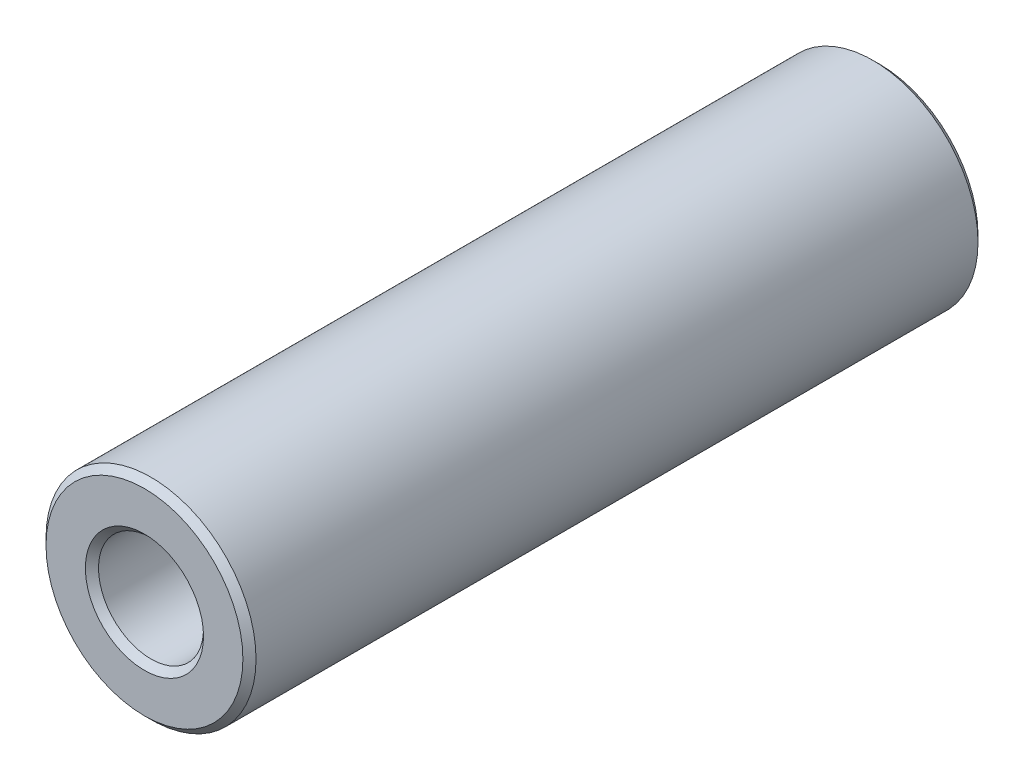
ISO-10303-21;
HEADER;
FILE_DESCRIPTION(('STEP AP214'),'2;1');
FILE_NAME('part.step','',(''),(''),'','','');
FILE_SCHEMA(('AUTOMOTIVE_DESIGN { 1 0 10303 214 1 1 1 1 }'));
ENDSEC;
DATA;
#1=APPLICATION_CONTEXT('core data for automotive mechanical design processes');
#2=APPLICATION_PROTOCOL_DEFINITION('international standard','automotive_design',2000,#1);
#3=PRODUCT_CONTEXT('',#1,'mechanical');
#4=PRODUCT('Part','Part','',(#3));
#5=PRODUCT_RELATED_PRODUCT_CATEGORY('part','',(#4));
#6=PRODUCT_DEFINITION_FORMATION('','',#4);
#7=PRODUCT_DEFINITION_CONTEXT('part definition',#1,'design');
#8=PRODUCT_DEFINITION('design','',#6,#7);
#9=PRODUCT_DEFINITION_SHAPE('','',#8);
#10=(LENGTH_UNIT() NAMED_UNIT(*) SI_UNIT(.MILLI.,.METRE.));
#11=(NAMED_UNIT(*) PLANE_ANGLE_UNIT() SI_UNIT($,.RADIAN.));
#12=(NAMED_UNIT(*) SI_UNIT($,.STERADIAN.) SOLID_ANGLE_UNIT());
#13=UNCERTAINTY_MEASURE_WITH_UNIT(LENGTH_MEASURE(1.E-05),#10,'distance_accuracy_value','');
#14=(GEOMETRIC_REPRESENTATION_CONTEXT(3) GLOBAL_UNCERTAINTY_ASSIGNED_CONTEXT((#13)) GLOBAL_UNIT_ASSIGNED_CONTEXT((#10,
#11,#12)) REPRESENTATION_CONTEXT('',''));
#15=CARTESIAN_POINT('',(0.,0.,0.));
#16=DIRECTION('',(0.,0.,1.));
#17=DIRECTION('',(1.,0.,0.));
#18=AXIS2_PLACEMENT_3D('',#15,#16,#17);
#19=CARTESIAN_POINT('',(0.,0.,28.));
#20=DIRECTION('',(0.,0.,0.999999999999999));
#21=DIRECTION('',(1.,0.,0.));
#22=AXIS2_PLACEMENT_3D('',#19,#20,#21);
#23=PLANE('',#22);
#24=CARTESIAN_POINT('',(0.,0.,28.));
#25=DIRECTION('',(0.,0.,0.999999999999999));
#26=DIRECTION('',(1.,0.,0.));
#27=AXIS2_PLACEMENT_3D('',#24,#25,#26);
#28=CIRCLE('',#27,2.25);
#29=CARTESIAN_POINT('',(2.25,0.,28.));
#30=VERTEX_POINT('',#29);
#31=EDGE_CURVE('E50',#30,#30,#28,.F.);
#32=ORIENTED_EDGE('',*,*,#31,.T.);
#33=EDGE_LOOP('',(#32));
#34=FACE_BOUND('',#33,.T.);
#35=CARTESIAN_POINT('',(0.,0.,28.));
#36=DIRECTION('',(0.,0.,0.999999999999999));
#37=DIRECTION('',(1.,0.,0.));
#38=AXIS2_PLACEMENT_3D('',#35,#36,#37);
#39=CIRCLE('',#38,3.75);
#40=CARTESIAN_POINT('',(-3.75,0.,28.));
#41=VERTEX_POINT('',#40);
#42=EDGE_CURVE('E53',#41,#41,#39,.T.);
#43=ORIENTED_EDGE('',*,*,#42,.T.);
#44=EDGE_LOOP('',(#43));
#45=FACE_BOUND('',#44,.T.);
#46=ADVANCED_FACE('F30',(#34,#45),#23,.T.);
#47=CARTESIAN_POINT('',(0.,0.,0.));
#48=DIRECTION('',(0.,0.,0.999999999999999));
#49=DIRECTION('',(1.,0.,0.));
#50=AXIS2_PLACEMENT_3D('',#47,#48,#49);
#51=PLANE('',#50);
#52=CARTESIAN_POINT('',(0.,0.,0.));
#53=DIRECTION('',(0.,0.,0.999999999999999));
#54=DIRECTION('',(1.,0.,0.));
#55=AXIS2_PLACEMENT_3D('',#52,#53,#54);
#56=CIRCLE('',#55,3.75);
#57=CARTESIAN_POINT('',(3.75,0.,0.));
#58=VERTEX_POINT('',#57);
#59=EDGE_CURVE('E10',#58,#58,#56,.F.);
#60=ORIENTED_EDGE('',*,*,#59,.T.);
#61=EDGE_LOOP('',(#60));
#62=FACE_BOUND('',#61,.T.);
#63=CARTESIAN_POINT('',(0.,0.,0.));
#64=DIRECTION('',(0.,0.,0.999999999999999));
#65=DIRECTION('',(1.,0.,0.));
#66=AXIS2_PLACEMENT_3D('',#63,#64,#65);
#67=CIRCLE('',#66,2.25);
#68=CARTESIAN_POINT('',(-2.25,0.,0.));
#69=VERTEX_POINT('',#68);
#70=EDGE_CURVE('E37',#69,#69,#67,.T.);
#71=ORIENTED_EDGE('',*,*,#70,.T.);
#72=EDGE_LOOP('',(#71));
#73=FACE_BOUND('',#72,.T.);
#74=ADVANCED_FACE('F77',(#62,#73),#51,.F.);
#75=CARTESIAN_POINT('',(0.,0.,28.));
#76=DIRECTION('',(0.,0.,-0.999999999999999));
#77=DIRECTION('',(-1.,0.,0.));
#78=AXIS2_PLACEMENT_3D('',#75,#76,#77);
#79=CYLINDRICAL_SURFACE('',#78,4.);
#80=CARTESIAN_POINT('',(0.,0.,27.75));
#81=DIRECTION('',(0.,0.,0.999999999999999));
#82=DIRECTION('',(1.,0.,0.));
#83=AXIS2_PLACEMENT_3D('',#80,#81,#82);
#84=CIRCLE('',#83,4.);
#85=CARTESIAN_POINT('',(-4.,0.,27.75));
#86=VERTEX_POINT('',#85);
#87=EDGE_CURVE('E41',#86,#86,#84,.F.);
#88=CARTESIAN_POINT('',(0.,0.,0.25));
#89=DIRECTION('',(0.,0.,0.999999999999999));
#90=DIRECTION('',(1.,0.,0.));
#91=AXIS2_PLACEMENT_3D('',#88,#89,#90);
#92=CIRCLE('',#91,4.);
#93=CARTESIAN_POINT('',(-4.,0.,0.249999999999997));
#94=VERTEX_POINT('',#93);
#95=EDGE_CURVE('E45',#94,#94,#92,.T.);
#96=CARTESIAN_POINT('',(-4.,0.,27.75));
#97=CARTESIAN_POINT('',(-4.,0.,27.4635416666666));
#98=CARTESIAN_POINT('',(-4.,0.,27.1770833333333));
#99=CARTESIAN_POINT('',(-4.,0.,26.6041666666666));
#100=CARTESIAN_POINT('',(-4.,0.,26.3177083333333));
#101=CARTESIAN_POINT('',(-4.,0.,25.7447916666666));
#102=CARTESIAN_POINT('',(-4.,0.,25.4583333333333));
#103=CARTESIAN_POINT('',(-4.,0.,24.8854166666666));
#104=CARTESIAN_POINT('',(-4.,0.,24.5989583333333));
#105=CARTESIAN_POINT('',(-4.,0.,24.0260416666666));
#106=CARTESIAN_POINT('',(-4.,0.,23.7395833333333));
#107=CARTESIAN_POINT('',(-4.,0.,23.1666666666666));
#108=CARTESIAN_POINT('',(-4.,0.,22.8802083333333));
#109=CARTESIAN_POINT('',(-4.,0.,22.3072916666666));
#110=CARTESIAN_POINT('',(-4.,0.,22.0208333333333));
#111=CARTESIAN_POINT('',(-4.,0.,21.4479166666666));
#112=CARTESIAN_POINT('',(-4.,0.,21.1614583333333));
#113=CARTESIAN_POINT('',(-4.,0.,20.5885416666666));
#114=CARTESIAN_POINT('',(-4.,0.,20.3020833333333));
#115=CARTESIAN_POINT('',(-4.,0.,19.7291666666666));
#116=CARTESIAN_POINT('',(-4.,0.,19.4427083333333));
#117=CARTESIAN_POINT('',(-4.,0.,18.8697916666666));
#118=CARTESIAN_POINT('',(-4.,0.,18.5833333333333));
#119=CARTESIAN_POINT('',(-4.,0.,18.0104166666666));
#120=CARTESIAN_POINT('',(-4.,0.,17.7239583333333));
#121=CARTESIAN_POINT('',(-4.,0.,17.1510416666666));
#122=CARTESIAN_POINT('',(-4.,0.,16.8645833333333));
#123=CARTESIAN_POINT('',(-4.,0.,16.2916666666666));
#124=CARTESIAN_POINT('',(-4.,0.,16.0052083333333));
#125=CARTESIAN_POINT('',(-4.,0.,15.4322916666666));
#126=CARTESIAN_POINT('',(-4.,0.,15.1458333333333));
#127=CARTESIAN_POINT('',(-4.,0.,14.5729166666666));
#128=CARTESIAN_POINT('',(-4.,0.,14.2864583333333));
#129=CARTESIAN_POINT('',(-4.,0.,13.7135416666666));
#130=CARTESIAN_POINT('',(-4.,0.,13.4270833333333));
#131=CARTESIAN_POINT('',(-4.,0.,12.8541666666666));
#132=CARTESIAN_POINT('',(-4.,0.,12.5677083333333));
#133=CARTESIAN_POINT('',(-4.,0.,11.9947916666666));
#134=CARTESIAN_POINT('',(-4.,0.,11.7083333333333));
#135=CARTESIAN_POINT('',(-4.,0.,11.1354166666666));
#136=CARTESIAN_POINT('',(-4.,0.,10.8489583333333));
#137=CARTESIAN_POINT('',(-4.,0.,10.2760416666667));
#138=CARTESIAN_POINT('',(-4.,0.,9.98958333333332));
#139=CARTESIAN_POINT('',(-4.,0.,9.41666666666665));
#140=CARTESIAN_POINT('',(-4.,0.,9.13020833333332));
#141=CARTESIAN_POINT('',(-4.,0.,8.55729166666665));
#142=CARTESIAN_POINT('',(-4.,0.,8.27083333333332));
#143=CARTESIAN_POINT('',(-4.,0.,7.69791666666666));
#144=CARTESIAN_POINT('',(-4.,0.,7.41145833333332));
#145=CARTESIAN_POINT('',(-4.,0.,6.83854166666666));
#146=CARTESIAN_POINT('',(-4.,0.,6.55208333333332));
#147=CARTESIAN_POINT('',(-4.,0.,5.97916666666666));
#148=CARTESIAN_POINT('',(-4.,0.,5.69270833333332));
#149=CARTESIAN_POINT('',(-4.,0.,5.11979166666666));
#150=CARTESIAN_POINT('',(-4.,0.,4.83333333333333));
#151=CARTESIAN_POINT('',(-4.,0.,4.26041666666666));
#152=CARTESIAN_POINT('',(-4.,0.,3.97395833333333));
#153=CARTESIAN_POINT('',(-4.,0.,3.40104166666666));
#154=CARTESIAN_POINT('',(-4.,0.,3.11458333333333));
#155=CARTESIAN_POINT('',(-4.,0.,2.54166666666666));
#156=CARTESIAN_POINT('',(-4.,0.,2.25520833333333));
#157=CARTESIAN_POINT('',(-4.,0.,1.68229166666666));
#158=CARTESIAN_POINT('',(-4.,0.,1.39583333333333));
#159=CARTESIAN_POINT('',(-4.,0.,0.822916666666663));
#160=CARTESIAN_POINT('',(-4.,0.,0.53645833333333));
#161=CARTESIAN_POINT('',(-4.,0.,0.249999999999997));
#162=B_SPLINE_CURVE_WITH_KNOTS('',3,(#96,#97,#98,#99,#100,#101,#102,#103,#104,#105,#106,#107,
#108,#109,#110,#111,#112,#113,#114,#115,#116,#117,#118,#119,#120,#121,#122,#123,#124,#125,#126,
#127,#128,#129,#130,#131,#132,#133,#134,#135,#136,#137,#138,#139,#140,#141,#142,#143,#144,#145,
#146,#147,#148,#149,#150,#151,#152,#153,#154,#155,#156,#157,#158,#159,#160,#161),.UNSPECIFIED.,
.F.,.F.,(4,2,2,2,2,2,2,2,2,2,2,2,2,2,2,2,2,2,2,2,2,2,2,2,2,2,2,2,2,2,2,2,4),(0.,
0.859374999999996,1.71874999999999,2.57812499999999,3.43749999999999,4.29687499999999,
5.15624999999999,6.01562499999999,6.87499999999999,7.73437499999999,8.59374999999999,
9.45312499999998,10.3125,11.171875,12.03125,12.890625,13.75,14.609375,15.46875,16.328125,
17.1875,18.046875,18.90625,19.765625,20.625,21.484375,22.34375,23.203125,24.0625,24.921875,
25.78125,26.640625,27.5),.UNSPECIFIED.);
#163=EDGE_CURVE('BSEAM32',#86,#94,#162,.T.);
#164=ORIENTED_EDGE('',*,*,#87,.T.);
#165=ORIENTED_EDGE('',*,*,#95,.T.);
#166=ORIENTED_EDGE('',*,*,#163,.T.);
#167=ORIENTED_EDGE('',*,*,#163,.F.);
#168=EDGE_LOOP('',(#164,#166,#165,#167));
#169=FACE_BOUND('',#168,.T.);
#170=ADVANCED_FACE('F32',(#169),#79,.T.);
#171=CARTESIAN_POINT('',(0.,0.,28.));
#172=DIRECTION('',(0.,0.,-0.999999999999999));
#173=DIRECTION('',(-1.,0.,0.));
#174=AXIS2_PLACEMENT_3D('',#171,#172,#173);
#175=CYLINDRICAL_SURFACE('',#174,2.);
#176=CARTESIAN_POINT('',(0.,0.,27.75));
#177=DIRECTION('',(0.,0.,0.999999999999999));
#178=DIRECTION('',(1.,0.,0.));
#179=AXIS2_PLACEMENT_3D('',#176,#177,#178);
#180=CIRCLE('',#179,2.);
#181=CARTESIAN_POINT('',(-2.,0.,27.75));
#182=VERTEX_POINT('',#181);
#183=EDGE_CURVE('E56',#182,#182,#180,.T.);
#184=CARTESIAN_POINT('',(0.,0.,0.25));
#185=DIRECTION('',(0.,0.,0.999999999999999));
#186=DIRECTION('',(1.,0.,0.));
#187=AXIS2_PLACEMENT_3D('',#184,#185,#186);
#188=CIRCLE('',#187,2.);
#189=CARTESIAN_POINT('',(-2.,0.,0.249999999999997));
#190=VERTEX_POINT('',#189);
#191=EDGE_CURVE('E59',#190,#190,#188,.F.);
#192=CARTESIAN_POINT('',(-2.,0.,27.75));
#193=CARTESIAN_POINT('',(-2.,0.,27.4635416666666));
#194=CARTESIAN_POINT('',(-2.,0.,27.1770833333333));
#195=CARTESIAN_POINT('',(-2.,0.,26.6041666666666));
#196=CARTESIAN_POINT('',(-2.,0.,26.3177083333333));
#197=CARTESIAN_POINT('',(-2.,0.,25.7447916666666));
#198=CARTESIAN_POINT('',(-2.,0.,25.4583333333333));
#199=CARTESIAN_POINT('',(-2.,0.,24.8854166666666));
#200=CARTESIAN_POINT('',(-2.,0.,24.5989583333333));
#201=CARTESIAN_POINT('',(-2.,0.,24.0260416666666));
#202=CARTESIAN_POINT('',(-2.,0.,23.7395833333333));
#203=CARTESIAN_POINT('',(-2.,0.,23.1666666666666));
#204=CARTESIAN_POINT('',(-2.,0.,22.8802083333333));
#205=CARTESIAN_POINT('',(-2.,0.,22.3072916666666));
#206=CARTESIAN_POINT('',(-2.,0.,22.0208333333333));
#207=CARTESIAN_POINT('',(-2.,0.,21.4479166666666));
#208=CARTESIAN_POINT('',(-2.,0.,21.1614583333333));
#209=CARTESIAN_POINT('',(-2.,0.,20.5885416666666));
#210=CARTESIAN_POINT('',(-2.,0.,20.3020833333333));
#211=CARTESIAN_POINT('',(-2.,0.,19.7291666666666));
#212=CARTESIAN_POINT('',(-2.,0.,19.4427083333333));
#213=CARTESIAN_POINT('',(-2.,0.,18.8697916666666));
#214=CARTESIAN_POINT('',(-2.,0.,18.5833333333333));
#215=CARTESIAN_POINT('',(-2.,0.,18.0104166666666));
#216=CARTESIAN_POINT('',(-2.,0.,17.7239583333333));
#217=CARTESIAN_POINT('',(-2.,0.,17.1510416666666));
#218=CARTESIAN_POINT('',(-2.,0.,16.8645833333333));
#219=CARTESIAN_POINT('',(-2.,0.,16.2916666666666));
#220=CARTESIAN_POINT('',(-2.,0.,16.0052083333333));
#221=CARTESIAN_POINT('',(-2.,0.,15.4322916666666));
#222=CARTESIAN_POINT('',(-2.,0.,15.1458333333333));
#223=CARTESIAN_POINT('',(-2.,0.,14.5729166666666));
#224=CARTESIAN_POINT('',(-2.,0.,14.2864583333333));
#225=CARTESIAN_POINT('',(-2.,0.,13.7135416666666));
#226=CARTESIAN_POINT('',(-2.,0.,13.4270833333333));
#227=CARTESIAN_POINT('',(-2.,0.,12.8541666666666));
#228=CARTESIAN_POINT('',(-2.,0.,12.5677083333333));
#229=CARTESIAN_POINT('',(-2.,0.,11.9947916666666));
#230=CARTESIAN_POINT('',(-2.,0.,11.7083333333333));
#231=CARTESIAN_POINT('',(-2.,0.,11.1354166666666));
#232=CARTESIAN_POINT('',(-2.,0.,10.8489583333333));
#233=CARTESIAN_POINT('',(-2.,0.,10.2760416666667));
#234=CARTESIAN_POINT('',(-2.,0.,9.98958333333332));
#235=CARTESIAN_POINT('',(-2.,0.,9.41666666666665));
#236=CARTESIAN_POINT('',(-2.,0.,9.13020833333332));
#237=CARTESIAN_POINT('',(-2.,0.,8.55729166666665));
#238=CARTESIAN_POINT('',(-2.,0.,8.27083333333332));
#239=CARTESIAN_POINT('',(-2.,0.,7.69791666666666));
#240=CARTESIAN_POINT('',(-2.,0.,7.41145833333332));
#241=CARTESIAN_POINT('',(-2.,0.,6.83854166666666));
#242=CARTESIAN_POINT('',(-2.,0.,6.55208333333332));
#243=CARTESIAN_POINT('',(-2.,0.,5.97916666666666));
#244=CARTESIAN_POINT('',(-2.,0.,5.69270833333332));
#245=CARTESIAN_POINT('',(-2.,0.,5.11979166666666));
#246=CARTESIAN_POINT('',(-2.,0.,4.83333333333333));
#247=CARTESIAN_POINT('',(-2.,0.,4.26041666666666));
#248=CARTESIAN_POINT('',(-2.,0.,3.97395833333333));
#249=CARTESIAN_POINT('',(-2.,0.,3.40104166666666));
#250=CARTESIAN_POINT('',(-2.,0.,3.11458333333333));
#251=CARTESIAN_POINT('',(-2.,0.,2.54166666666666));
#252=CARTESIAN_POINT('',(-2.,0.,2.25520833333333));
#253=CARTESIAN_POINT('',(-2.,0.,1.68229166666666));
#254=CARTESIAN_POINT('',(-2.,0.,1.39583333333333));
#255=CARTESIAN_POINT('',(-2.,0.,0.822916666666663));
#256=CARTESIAN_POINT('',(-2.,0.,0.53645833333333));
#257=CARTESIAN_POINT('',(-2.,0.,0.249999999999997));
#258=B_SPLINE_CURVE_WITH_KNOTS('',3,(#192,#193,#194,#195,#196,#197,#198,#199,#200,#201,#202,
#203,#204,#205,#206,#207,#208,#209,#210,#211,#212,#213,#214,#215,#216,#217,#218,#219,#220,#221,
#222,#223,#224,#225,#226,#227,#228,#229,#230,#231,#232,#233,#234,#235,#236,#237,#238,#239,#240,
#241,#242,#243,#244,#245,#246,#247,#248,#249,#250,#251,#252,#253,#254,#255,#256,#257),
.UNSPECIFIED.,.F.,.F.,(4,2,2,2,2,2,2,2,2,2,2,2,2,2,2,2,2,2,2,2,2,2,2,2,2,2,2,2,2,2,2,2,4),(0.,
0.859374999999996,1.71874999999999,2.57812499999999,3.43749999999999,4.29687499999999,
5.15624999999999,6.01562499999999,6.87499999999999,7.73437499999999,8.59374999999999,
9.45312499999998,10.3125,11.171875,12.03125,12.890625,13.75,14.609375,15.46875,16.328125,
17.1875,18.046875,18.90625,19.765625,20.625,21.484375,22.34375,23.203125,24.0625,24.921875,
25.78125,26.640625,27.5),.UNSPECIFIED.);
#259=EDGE_CURVE('BSEAM63',#182,#190,#258,.T.);
#260=ORIENTED_EDGE('',*,*,#183,.T.);
#261=ORIENTED_EDGE('',*,*,#191,.T.);
#262=ORIENTED_EDGE('',*,*,#259,.T.);
#263=ORIENTED_EDGE('',*,*,#259,.F.);
#264=EDGE_LOOP('',(#260,#262,#261,#263));
#265=FACE_BOUND('',#264,.T.);
#266=ADVANCED_FACE('F63',(#265),#175,.F.);
#267=CARTESIAN_POINT('',(0.,0.,27.75));
#268=DIRECTION('',(0.,0.,0.999999999999999));
#269=DIRECTION('',(1.,0.,0.));
#270=AXIS2_PLACEMENT_3D('',#267,#268,#269);
#271=CONICAL_SURFACE('',#270,2.,0.785398163397445);
#272=ORIENTED_EDGE('',*,*,#31,.F.);
#273=EDGE_LOOP('',(#272));
#274=FACE_BOUND('',#273,.T.);
#275=ORIENTED_EDGE('',*,*,#183,.F.);
#276=EDGE_LOOP('',(#275));
#277=FACE_BOUND('',#276,.T.);
#278=ADVANCED_FACE('F87',(#274,#277),#271,.F.);
#279=CARTESIAN_POINT('',(0.,0.,28.));
#280=DIRECTION('',(0.,0.,-0.999999999999999));
#281=DIRECTION('',(-1.,0.,0.));
#282=AXIS2_PLACEMENT_3D('',#279,#280,#281);
#283=CONICAL_SURFACE('',#282,3.75,0.785398163397457);
#284=CARTESIAN_POINT('',(-4.,0.,27.75));
#285=CARTESIAN_POINT('',(-3.99739583333333,0.,27.7526041666666));
#286=CARTESIAN_POINT('',(-3.99479166666667,0.,27.7552083333333));
#287=CARTESIAN_POINT('',(-3.98958333333333,0.,27.7604166666666));
#288=CARTESIAN_POINT('',(-3.98697916666667,0.,27.7630208333333));
#289=CARTESIAN_POINT('',(-3.98177083333333,0.,27.7682291666666));
#290=CARTESIAN_POINT('',(-3.97916666666667,0.,27.7708333333333));
#291=CARTESIAN_POINT('',(-3.97395833333333,0.,27.7760416666666));
#292=CARTESIAN_POINT('',(-3.97135416666667,0.,27.7786458333333));
#293=CARTESIAN_POINT('',(-3.96614583333333,0.,27.7838541666666));
#294=CARTESIAN_POINT('',(-3.96354166666667,0.,27.7864583333333));
#295=CARTESIAN_POINT('',(-3.95833333333333,0.,27.7916666666666));
#296=CARTESIAN_POINT('',(-3.95572916666667,0.,27.7942708333333));
#297=CARTESIAN_POINT('',(-3.95052083333333,0.,27.7994791666666));
#298=CARTESIAN_POINT('',(-3.94791666666667,0.,27.8020833333333));
#299=CARTESIAN_POINT('',(-3.94270833333333,0.,27.8072916666666));
#300=CARTESIAN_POINT('',(-3.94010416666667,0.,27.8098958333333));
#301=CARTESIAN_POINT('',(-3.93489583333333,0.,27.8151041666666));
#302=CARTESIAN_POINT('',(-3.93229166666667,0.,27.8177083333333));
#303=CARTESIAN_POINT('',(-3.92708333333333,0.,27.8229166666666));
#304=CARTESIAN_POINT('',(-3.92447916666667,0.,27.8255208333333));
#305=CARTESIAN_POINT('',(-3.91927083333333,0.,27.8307291666666));
#306=CARTESIAN_POINT('',(-3.91666666666667,0.,27.8333333333333));
#307=CARTESIAN_POINT('',(-3.91145833333333,0.,27.8385416666666));
#308=CARTESIAN_POINT('',(-3.90885416666666,0.,27.8411458333333));
#309=CARTESIAN_POINT('',(-3.90364583333333,0.,27.8463541666666));
#310=CARTESIAN_POINT('',(-3.90104166666667,0.,27.8489583333333));
#311=CARTESIAN_POINT('',(-3.89583333333333,0.,27.8541666666666));
#312=CARTESIAN_POINT('',(-3.89322916666667,0.,27.8567708333333));
#313=CARTESIAN_POINT('',(-3.88802083333333,0.,27.8619791666666));
#314=CARTESIAN_POINT('',(-3.88541666666667,0.,27.8645833333333));
#315=CARTESIAN_POINT('',(-3.88020833333333,0.,27.8697916666666));
#316=CARTESIAN_POINT('',(-3.87760416666666,0.,27.8723958333333));
#317=CARTESIAN_POINT('',(-3.87239583333333,0.,27.8776041666666));
#318=CARTESIAN_POINT('',(-3.86979166666667,0.,27.8802083333333));
#319=CARTESIAN_POINT('',(-3.86458333333333,0.,27.8854166666666));
#320=CARTESIAN_POINT('',(-3.86197916666667,0.,27.8880208333333));
#321=CARTESIAN_POINT('',(-3.85677083333333,0.,27.8932291666666));
#322=CARTESIAN_POINT('',(-3.85416666666666,0.,27.8958333333333));
#323=CARTESIAN_POINT('',(-3.84895833333333,0.,27.9010416666666));
#324=CARTESIAN_POINT('',(-3.84635416666666,0.,27.9036458333333));
#325=CARTESIAN_POINT('',(-3.84114583333333,0.,27.9088541666666));
#326=CARTESIAN_POINT('',(-3.83854166666666,0.,27.9114583333333));
#327=CARTESIAN_POINT('',(-3.83333333333333,0.,27.9166666666666));
#328=CARTESIAN_POINT('',(-3.83072916666666,0.,27.9192708333333));
#329=CARTESIAN_POINT('',(-3.82552083333333,0.,27.9244791666666));
#330=CARTESIAN_POINT('',(-3.82291666666666,0.,27.9270833333333));
#331=CARTESIAN_POINT('',(-3.81770833333333,0.,27.9322916666666));
#332=CARTESIAN_POINT('',(-3.81510416666666,0.,27.9348958333333));
#333=CARTESIAN_POINT('',(-3.80989583333333,0.,27.9401041666666));
#334=CARTESIAN_POINT('',(-3.80729166666666,0.,27.9427083333333));
#335=CARTESIAN_POINT('',(-3.80208333333333,0.,27.9479166666666));
#336=CARTESIAN_POINT('',(-3.79947916666666,0.,27.9505208333333));
#337=CARTESIAN_POINT('',(-3.79427083333333,0.,27.9557291666666));
#338=CARTESIAN_POINT('',(-3.79166666666666,0.,27.9583333333333));
#339=CARTESIAN_POINT('',(-3.78645833333333,0.,27.9635416666666));
#340=CARTESIAN_POINT('',(-3.78385416666666,0.,27.9661458333333));
#341=CARTESIAN_POINT('',(-3.77864583333333,0.,27.9713541666666));
#342=CARTESIAN_POINT('',(-3.77604166666666,0.,27.9739583333333));
#343=CARTESIAN_POINT('',(-3.77083333333333,0.,27.9791666666666));
#344=CARTESIAN_POINT('',(-3.76822916666666,0.,27.9817708333333));
#345=CARTESIAN_POINT('',(-3.76302083333333,0.,27.9869791666666));
#346=CARTESIAN_POINT('',(-3.76041666666666,0.,27.9895833333333));
#347=CARTESIAN_POINT('',(-3.75520833333333,0.,27.9947916666666));
#348=CARTESIAN_POINT('',(-3.75260416666666,0.,27.9973958333333));
#349=CARTESIAN_POINT('',(-3.75,0.,28.));
#350=B_SPLINE_CURVE_WITH_KNOTS('',3,(#284,#285,#286,#287,#288,#289,#290,#291,#292,#293,#294,
#295,#296,#297,#298,#299,#300,#301,#302,#303,#304,#305,#306,#307,#308,#309,#310,#311,#312,#313,
#314,#315,#316,#317,#318,#319,#320,#321,#322,#323,#324,#325,#326,#327,#328,#329,#330,#331,#332,
#333,#334,#335,#336,#337,#338,#339,#340,#341,#342,#343,#344,#345,#346,#347,#348,#349),
.UNSPECIFIED.,.F.,.F.,(4,2,2,2,2,2,2,2,2,2,2,2,2,2,2,2,2,2,2,2,2,2,2,2,2,2,2,2,2,2,2,2,4),(0.,
0.0110485434560417,0.0220970869120809,0.0331456303681201,0.0441941738241593,0.0552427172802015,
0.0662912607362407,0.0773398041922799,0.0883883476483191,0.0994368911043608,0.1104854345604,
0.12153397801644,0.132582521472479,0.14363106492852,0.15467960838456,0.165728151840599,
0.176776695296638,0.18782523875268,0.198873782208719,0.209922325664759,0.220970869120798,
0.23201941257684,0.243067956032879,0.254116499488918,0.265165042944957,0.276213586400999,
0.287262129857039,0.298310673313078,0.309359216769117,0.320407760225159,0.331456303681198,
0.342504847137238,0.353553390593279),.UNSPECIFIED.);
#351=EDGE_CURVE('BSEAM73',#86,#41,#350,.T.);
#352=ORIENTED_EDGE('',*,*,#87,.F.);
#353=ORIENTED_EDGE('',*,*,#42,.F.);
#354=ORIENTED_EDGE('',*,*,#351,.T.);
#355=ORIENTED_EDGE('',*,*,#351,.F.);
#356=EDGE_LOOP('',(#352,#354,#353,#355));
#357=FACE_BOUND('',#356,.T.);
#358=ADVANCED_FACE('F73',(#357),#283,.T.);
#359=CARTESIAN_POINT('',(0.,0.,0.25));
#360=DIRECTION('',(0.,0.,0.999999999999999));
#361=DIRECTION('',(1.,0.,0.));
#362=AXIS2_PLACEMENT_3D('',#359,#360,#361);
#363=CONICAL_SURFACE('',#362,4.,0.785398163397445);
#364=ORIENTED_EDGE('',*,*,#59,.F.);
#365=EDGE_LOOP('',(#364));
#366=FACE_BOUND('',#365,.T.);
#367=ORIENTED_EDGE('',*,*,#95,.F.);
#368=EDGE_LOOP('',(#367));
#369=FACE_BOUND('',#368,.T.);
#370=ADVANCED_FACE('F68',(#366,#369),#363,.T.);
#371=CARTESIAN_POINT('',(0.,0.,0.));
#372=DIRECTION('',(0.,0.,-0.999999999999999));
#373=DIRECTION('',(-1.,0.,0.));
#374=AXIS2_PLACEMENT_3D('',#371,#372,#373);
#375=CONICAL_SURFACE('',#374,2.25,0.785398163397457);
#376=CARTESIAN_POINT('',(-2.,0.,0.25));
#377=CARTESIAN_POINT('',(-2.00260416666667,0.,0.247395833333334));
#378=CARTESIAN_POINT('',(-2.00520833333333,0.,0.244791666666667));
#379=CARTESIAN_POINT('',(-2.01041666666667,0.,0.239583333333333));
#380=CARTESIAN_POINT('',(-2.01302083333333,0.,0.236979166666667));
#381=CARTESIAN_POINT('',(-2.01822916666667,0.,0.231770833333333));
#382=CARTESIAN_POINT('',(-2.02083333333333,0.,0.229166666666667));
#383=CARTESIAN_POINT('',(-2.02604166666667,0.,0.223958333333334));
#384=CARTESIAN_POINT('',(-2.02864583333333,0.,0.221354166666667));
#385=CARTESIAN_POINT('',(-2.03385416666667,0.,0.216145833333333));
#386=CARTESIAN_POINT('',(-2.03645833333333,0.,0.213541666666667));
#387=CARTESIAN_POINT('',(-2.04166666666667,0.,0.208333333333333));
#388=CARTESIAN_POINT('',(-2.04427083333333,0.,0.205729166666667));
#389=CARTESIAN_POINT('',(-2.04947916666667,0.,0.200520833333334));
#390=CARTESIAN_POINT('',(-2.05208333333333,0.,0.197916666666667));
#391=CARTESIAN_POINT('',(-2.05729166666667,0.,0.192708333333333));
#392=CARTESIAN_POINT('',(-2.05989583333333,0.,0.190104166666667));
#393=CARTESIAN_POINT('',(-2.06510416666667,0.,0.184895833333333));
#394=CARTESIAN_POINT('',(-2.06770833333333,0.,0.182291666666667));
#395=CARTESIAN_POINT('',(-2.07291666666667,0.,0.177083333333334));
#396=CARTESIAN_POINT('',(-2.07552083333333,0.,0.174479166666667));
#397=CARTESIAN_POINT('',(-2.08072916666667,0.,0.169270833333333));
#398=CARTESIAN_POINT('',(-2.08333333333333,0.,0.166666666666667));
#399=CARTESIAN_POINT('',(-2.08854166666667,0.,0.161458333333333));
#400=CARTESIAN_POINT('',(-2.09114583333333,0.,0.158854166666667));
#401=CARTESIAN_POINT('',(-2.09635416666667,0.,0.153645833333333));
#402=CARTESIAN_POINT('',(-2.09895833333333,0.,0.151041666666667));
#403=CARTESIAN_POINT('',(-2.10416666666667,0.,0.145833333333333));
#404=CARTESIAN_POINT('',(-2.10677083333333,0.,0.143229166666667));
#405=CARTESIAN_POINT('',(-2.11197916666667,0.,0.138020833333333));
#406=CARTESIAN_POINT('',(-2.11458333333333,0.,0.135416666666667));
#407=CARTESIAN_POINT('',(-2.11979166666667,0.,0.130208333333333));
#408=CARTESIAN_POINT('',(-2.12239583333333,0.,0.127604166666667));
#409=CARTESIAN_POINT('',(-2.12760416666667,0.,0.122395833333333));
#410=CARTESIAN_POINT('',(-2.13020833333333,0.,0.119791666666667));
#411=CARTESIAN_POINT('',(-2.13541666666667,0.,0.114583333333333));
#412=CARTESIAN_POINT('',(-2.13802083333334,0.,0.111979166666667));
#413=CARTESIAN_POINT('',(-2.14322916666667,0.,0.106770833333333));
#414=CARTESIAN_POINT('',(-2.14583333333334,0.,0.104166666666667));
#415=CARTESIAN_POINT('',(-2.15104166666667,0.,0.0989583333333334));
#416=CARTESIAN_POINT('',(-2.15364583333334,0.,0.0963541666666668));
#417=CARTESIAN_POINT('',(-2.15885416666667,0.,0.0911458333333334));
#418=CARTESIAN_POINT('',(-2.16145833333334,0.,0.0885416666666667));
#419=CARTESIAN_POINT('',(-2.16666666666667,0.,0.0833333333333333));
#420=CARTESIAN_POINT('',(-2.16927083333334,0.,0.0807291666666667));
#421=CARTESIAN_POINT('',(-2.17447916666667,0.,0.0755208333333334));
#422=CARTESIAN_POINT('',(-2.17708333333334,0.,0.0729166666666667));
#423=CARTESIAN_POINT('',(-2.18229166666667,0.,0.0677083333333334));
#424=CARTESIAN_POINT('',(-2.18489583333334,0.,0.0651041666666667));
#425=CARTESIAN_POINT('',(-2.19010416666667,0.,0.0598958333333333));
#426=CARTESIAN_POINT('',(-2.19270833333334,0.,0.0572916666666667));
#427=CARTESIAN_POINT('',(-2.19791666666667,0.,0.0520833333333334));
#428=CARTESIAN_POINT('',(-2.20052083333334,0.,0.0494791666666667));
#429=CARTESIAN_POINT('',(-2.20572916666667,0.,0.0442708333333333));
#430=CARTESIAN_POINT('',(-2.20833333333334,0.,0.0416666666666667));
#431=CARTESIAN_POINT('',(-2.21354166666667,0.,0.0364583333333333));
#432=CARTESIAN_POINT('',(-2.21614583333334,0.,0.0338541666666667));
#433=CARTESIAN_POINT('',(-2.22135416666667,0.,0.0286458333333334));
#434=CARTESIAN_POINT('',(-2.22395833333334,0.,0.0260416666666667));
#435=CARTESIAN_POINT('',(-2.22916666666667,0.,0.0208333333333333));
#436=CARTESIAN_POINT('',(-2.23177083333334,0.,0.0182291666666666));
#437=CARTESIAN_POINT('',(-2.23697916666667,0.,0.0130208333333333));
#438=CARTESIAN_POINT('',(-2.23958333333334,0.,0.0104166666666667));
#439=CARTESIAN_POINT('',(-2.24479166666667,0.,0.0052083333333334));
#440=CARTESIAN_POINT('',(-2.24739583333334,0.,0.00260416666666677));
#441=CARTESIAN_POINT('',(-2.25,0.,0.));
#442=B_SPLINE_CURVE_WITH_KNOTS('',3,(#376,#377,#378,#379,#380,#381,#382,#383,#384,#385,#386,
#387,#388,#389,#390,#391,#392,#393,#394,#395,#396,#397,#398,#399,#400,#401,#402,#403,#404,#405,
#406,#407,#408,#409,#410,#411,#412,#413,#414,#415,#416,#417,#418,#419,#420,#421,#422,#423,#424,
#425,#426,#427,#428,#429,#430,#431,#432,#433,#434,#435,#436,#437,#438,#439,#440,#441),
.UNSPECIFIED.,.F.,.F.,(4,2,2,2,2,2,2,2,2,2,2,2,2,2,2,2,2,2,2,2,2,2,2,2,2,2,2,2,2,2,2,2,4),(0.,
0.0110485434560398,0.0220970869120796,0.0331456303681198,0.0441941738241595,0.0552427172801994,
0.0662912607362395,0.0773398041922793,0.0883883476483191,0.0994368911043592,0.110485434560399,
0.121533978016439,0.132582521472479,0.143631064928519,0.154679608384559,0.165728151840599,
0.176776695296639,0.187825238752678,0.198873782208719,0.209922325664758,0.220970869120798,
0.232019412576838,0.243067956032878,0.254116499488918,0.265165042944958,0.276213586400998,
0.287262129857038,0.298310673313077,0.309359216769118,0.320407760225157,0.331456303681197,
0.342504847137237,0.353553390593277),.UNSPECIFIED.);
#443=EDGE_CURVE('BSEAM65',#190,#69,#442,.T.);
#444=ORIENTED_EDGE('',*,*,#191,.F.);
#445=ORIENTED_EDGE('',*,*,#70,.F.);
#446=ORIENTED_EDGE('',*,*,#443,.T.);
#447=ORIENTED_EDGE('',*,*,#443,.F.);
#448=EDGE_LOOP('',(#444,#446,#445,#447));
#449=FACE_BOUND('',#448,.T.);
#450=ADVANCED_FACE('F65',(#449),#375,.F.);
#451=CLOSED_SHELL('',(#46,#74,#170,#266,#278,#358,#370,#450));
#452=MANIFOLD_SOLID_BREP('B2',#451);
#453=ADVANCED_BREP_SHAPE_REPRESENTATION('',(#18,#452),#14);
#454=SHAPE_DEFINITION_REPRESENTATION(#9,#453);
ENDSEC;
END-ISO-10303-21;
